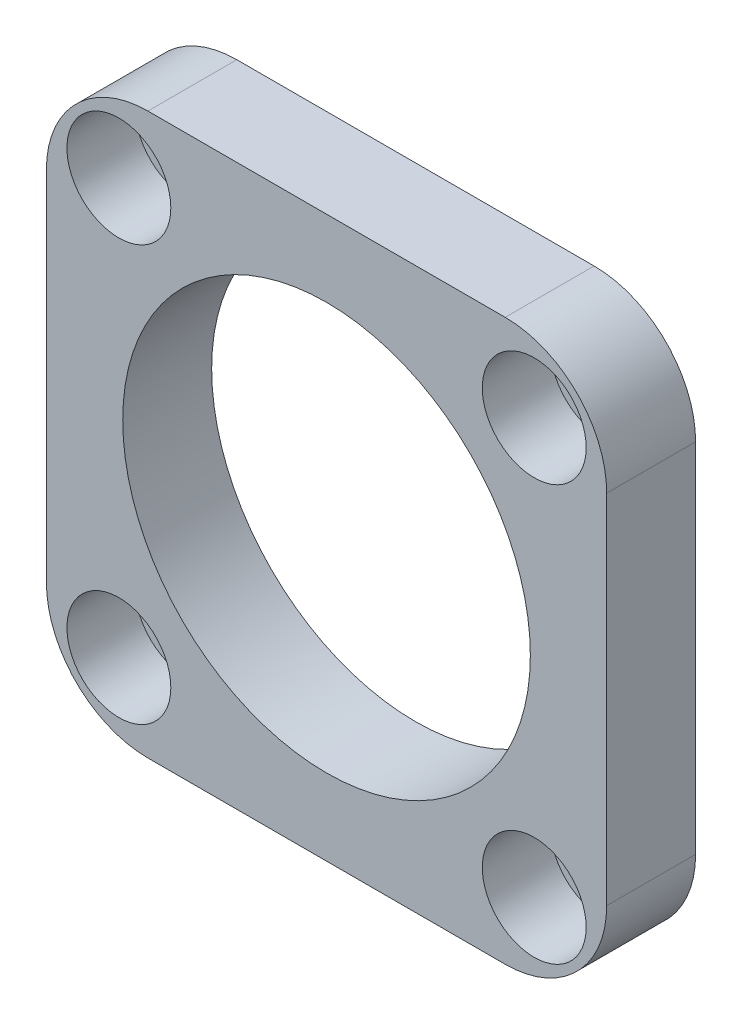
ISO-10303-21;
HEADER;
FILE_DESCRIPTION(('STEP AP214'),'2;1');
FILE_NAME('part.step','',(''),(''),'','','');
FILE_SCHEMA(('AUTOMOTIVE_DESIGN { 1 0 10303 214 1 1 1 1 }'));
ENDSEC;
DATA;
#1=APPLICATION_CONTEXT('core data for automotive mechanical design processes');
#2=APPLICATION_PROTOCOL_DEFINITION('international standard','automotive_design',2000,#1);
#3=PRODUCT_CONTEXT('',#1,'mechanical');
#4=PRODUCT('Part','Part','',(#3));
#5=PRODUCT_RELATED_PRODUCT_CATEGORY('part','',(#4));
#6=PRODUCT_DEFINITION_FORMATION('','',#4);
#7=PRODUCT_DEFINITION_CONTEXT('part definition',#1,'design');
#8=PRODUCT_DEFINITION('design','',#6,#7);
#9=PRODUCT_DEFINITION_SHAPE('','',#8);
#10=(LENGTH_UNIT() NAMED_UNIT(*) SI_UNIT(.MILLI.,.METRE.));
#11=(NAMED_UNIT(*) PLANE_ANGLE_UNIT() SI_UNIT($,.RADIAN.));
#12=(NAMED_UNIT(*) SI_UNIT($,.STERADIAN.) SOLID_ANGLE_UNIT());
#13=UNCERTAINTY_MEASURE_WITH_UNIT(LENGTH_MEASURE(1.E-05),#10,'distance_accuracy_value','');
#14=(GEOMETRIC_REPRESENTATION_CONTEXT(3) GLOBAL_UNCERTAINTY_ASSIGNED_CONTEXT((#13)) GLOBAL_UNIT_ASSIGNED_CONTEXT((#10,
#11,#12)) REPRESENTATION_CONTEXT('',''));
#15=CARTESIAN_POINT('',(0.,0.,0.));
#16=DIRECTION('',(0.,0.,1.));
#17=DIRECTION('',(1.,0.,0.));
#18=AXIS2_PLACEMENT_3D('',#15,#16,#17);
#19=CARTESIAN_POINT('',(-17.526,17.526,5.5626));
#20=DIRECTION('',(1.,0.,0.));
#21=DIRECTION('',(0.,1.,0.));
#22=AXIS2_PLACEMENT_3D('',#19,#20,#21);
#23=PLANE('',#22);
#24=DIRECTION('',(0.,-1.,0.));
#25=VECTOR('',#24,1.);
#26=CARTESIAN_POINT('',(-17.526,17.526,0.));
#27=LINE('',#26,#25);
#28=CARTESIAN_POINT('',(-17.526,11.176,0.));
#29=VERTEX_POINT('',#28);
#30=CARTESIAN_POINT('',(-17.526,-11.176,0.));
#31=VERTEX_POINT('',#30);
#32=EDGE_CURVE('E136',#29,#31,#27,.T.);
#33=ORIENTED_EDGE('',*,*,#32,.T.);
#34=DIRECTION('',(0.,0.,-1.));
#35=VECTOR('',#34,1.);
#36=CARTESIAN_POINT('',(-17.526,-11.176,5.5626));
#37=LINE('',#36,#35);
#38=CARTESIAN_POINT('',(-17.526,-11.176,5.5626));
#39=VERTEX_POINT('',#38);
#40=EDGE_CURVE('E159',#31,#39,#37,.F.);
#41=ORIENTED_EDGE('',*,*,#40,.T.);
#42=DIRECTION('',(0.,-1.,0.));
#43=VECTOR('',#42,1.);
#44=CARTESIAN_POINT('',(-17.526,17.526,5.5626));
#45=LINE('',#44,#43);
#46=CARTESIAN_POINT('',(-17.526,11.176,5.5626));
#47=VERTEX_POINT('',#46);
#48=EDGE_CURVE('E134',#47,#39,#45,.T.);
#49=ORIENTED_EDGE('',*,*,#48,.F.);
#50=DIRECTION('',(0.,0.,-1.));
#51=VECTOR('',#50,1.);
#52=CARTESIAN_POINT('',(-17.526,11.176,5.5626));
#53=LINE('',#52,#51);
#54=EDGE_CURVE('E156',#47,#29,#53,.T.);
#55=ORIENTED_EDGE('',*,*,#54,.T.);
#56=EDGE_LOOP('',(#33,#41,#49,#55));
#57=FACE_BOUND('',#56,.T.);
#58=ADVANCED_FACE('F39',(#57),#23,.F.);
#59=CARTESIAN_POINT('',(-17.526,-17.526,5.5626));
#60=DIRECTION('',(0.,1.,0.));
#61=DIRECTION('',(-1.,0.,0.));
#62=AXIS2_PLACEMENT_3D('',#59,#60,#61);
#63=PLANE('',#62);
#64=DIRECTION('',(0.,0.,-1.));
#65=VECTOR('',#64,1.);
#66=CARTESIAN_POINT('',(11.176,-17.526,5.5626));
#67=LINE('',#66,#65);
#68=CARTESIAN_POINT('',(11.176,-17.526,0.));
#69=VERTEX_POINT('',#68);
#70=CARTESIAN_POINT('',(11.176,-17.526,5.5626));
#71=VERTEX_POINT('',#70);
#72=EDGE_CURVE('E110',#69,#71,#67,.F.);
#73=ORIENTED_EDGE('',*,*,#72,.T.);
#74=DIRECTION('',(1.,0.,0.));
#75=VECTOR('',#74,1.);
#76=CARTESIAN_POINT('',(-17.526,-17.526,5.5626));
#77=LINE('',#76,#75);
#78=CARTESIAN_POINT('',(-11.176,-17.526,5.5626));
#79=VERTEX_POINT('',#78);
#80=EDGE_CURVE('E175',#79,#71,#77,.T.);
#81=ORIENTED_EDGE('',*,*,#80,.F.);
#82=DIRECTION('',(0.,0.,-1.));
#83=VECTOR('',#82,1.);
#84=CARTESIAN_POINT('',(-11.176,-17.526,5.5626));
#85=LINE('',#84,#83);
#86=CARTESIAN_POINT('',(-11.176,-17.526,0.));
#87=VERTEX_POINT('',#86);
#88=EDGE_CURVE('E115',#79,#87,#85,.T.);
#89=ORIENTED_EDGE('',*,*,#88,.T.);
#90=DIRECTION('',(1.,0.,0.));
#91=VECTOR('',#90,1.);
#92=CARTESIAN_POINT('',(-17.526,-17.526,0.));
#93=LINE('',#92,#91);
#94=EDGE_CURVE('E132',#87,#69,#93,.T.);
#95=ORIENTED_EDGE('',*,*,#94,.T.);
#96=EDGE_LOOP('',(#73,#81,#89,#95));
#97=FACE_BOUND('',#96,.T.);
#98=ADVANCED_FACE('F267',(#97),#63,.F.);
#99=CARTESIAN_POINT('',(17.526,17.526,5.5626));
#100=DIRECTION('',(-1.,0.,0.));
#101=DIRECTION('',(0.,0.,1.));
#102=AXIS2_PLACEMENT_3D('',#99,#100,#101);
#103=PLANE('',#102);
#104=DIRECTION('',(0.,1.,0.));
#105=VECTOR('',#104,1.);
#106=CARTESIAN_POINT('',(17.526,17.526,5.5626));
#107=LINE('',#106,#105);
#108=CARTESIAN_POINT('',(17.526,-11.176,5.5626));
#109=VERTEX_POINT('',#108);
#110=CARTESIAN_POINT('',(17.526,11.176,5.5626));
#111=VERTEX_POINT('',#110);
#112=EDGE_CURVE('E124',#109,#111,#107,.T.);
#113=ORIENTED_EDGE('',*,*,#112,.F.);
#114=DIRECTION('',(0.,0.,-1.));
#115=VECTOR('',#114,1.);
#116=CARTESIAN_POINT('',(17.526,-11.176,5.5626));
#117=LINE('',#116,#115);
#118=CARTESIAN_POINT('',(17.526,-11.176,0.));
#119=VERTEX_POINT('',#118);
#120=EDGE_CURVE('E108',#109,#119,#117,.T.);
#121=ORIENTED_EDGE('',*,*,#120,.T.);
#122=DIRECTION('',(0.,1.,0.));
#123=VECTOR('',#122,1.);
#124=CARTESIAN_POINT('',(17.526,17.526,0.));
#125=LINE('',#124,#123);
#126=CARTESIAN_POINT('',(17.526,11.176,0.));
#127=VERTEX_POINT('',#126);
#128=EDGE_CURVE('E122',#119,#127,#125,.T.);
#129=ORIENTED_EDGE('',*,*,#128,.T.);
#130=DIRECTION('',(0.,0.,-1.));
#131=VECTOR('',#130,1.);
#132=CARTESIAN_POINT('',(17.526,11.176,5.5626));
#133=LINE('',#132,#131);
#134=EDGE_CURVE('E126',#127,#111,#133,.F.);
#135=ORIENTED_EDGE('',*,*,#134,.T.);
#136=EDGE_LOOP('',(#113,#121,#129,#135));
#137=FACE_BOUND('',#136,.T.);
#138=ADVANCED_FACE('F121',(#137),#103,.F.);
#139=CARTESIAN_POINT('',(-17.526,17.526,5.5626));
#140=DIRECTION('',(0.,-1.,0.));
#141=DIRECTION('',(1.,0.,0.));
#142=AXIS2_PLACEMENT_3D('',#139,#140,#141);
#143=PLANE('',#142);
#144=DIRECTION('',(-1.,0.,0.));
#145=VECTOR('',#144,1.);
#146=CARTESIAN_POINT('',(-17.526,17.526,0.));
#147=LINE('',#146,#145);
#148=CARTESIAN_POINT('',(11.176,17.526,0.));
#149=VERTEX_POINT('',#148);
#150=CARTESIAN_POINT('',(-11.176,17.526,0.));
#151=VERTEX_POINT('',#150);
#152=EDGE_CURVE('E131',#149,#151,#147,.T.);
#153=ORIENTED_EDGE('',*,*,#152,.T.);
#154=DIRECTION('',(0.,0.,-1.));
#155=VECTOR('',#154,1.);
#156=CARTESIAN_POINT('',(-11.176,17.526,5.5626));
#157=LINE('',#156,#155);
#158=CARTESIAN_POINT('',(-11.176,17.526,5.5626));
#159=VERTEX_POINT('',#158);
#160=EDGE_CURVE('E11',#151,#159,#157,.F.);
#161=ORIENTED_EDGE('',*,*,#160,.T.);
#162=DIRECTION('',(-1.,0.,0.));
#163=VECTOR('',#162,1.);
#164=CARTESIAN_POINT('',(-17.526,17.526,5.5626));
#165=LINE('',#164,#163);
#166=CARTESIAN_POINT('',(11.176,17.526,5.5626));
#167=VERTEX_POINT('',#166);
#168=EDGE_CURVE('E140',#167,#159,#165,.T.);
#169=ORIENTED_EDGE('',*,*,#168,.F.);
#170=DIRECTION('',(0.,0.,-1.));
#171=VECTOR('',#170,1.);
#172=CARTESIAN_POINT('',(11.176,17.526,5.5626));
#173=LINE('',#172,#171);
#174=EDGE_CURVE('E47',#167,#149,#173,.T.);
#175=ORIENTED_EDGE('',*,*,#174,.T.);
#176=EDGE_LOOP('',(#153,#161,#169,#175));
#177=FACE_BOUND('',#176,.T.);
#178=ADVANCED_FACE('F162',(#177),#143,.F.);
#179=CARTESIAN_POINT('',(-17.526,-17.526,0.));
#180=DIRECTION('',(0.,0.,1.));
#181=DIRECTION('',(1.,0.,0.));
#182=AXIS2_PLACEMENT_3D('',#179,#180,#181);
#183=PLANE('',#182);
#184=CARTESIAN_POINT('',(-12.9921,12.9921,0.));
#185=DIRECTION('',(0.,0.,1.));
#186=DIRECTION('',(1.,0.,0.));
#187=AXIS2_PLACEMENT_3D('',#184,#185,#186);
#188=CIRCLE('',#187,2.);
#189=CARTESIAN_POINT('',(-10.9921,12.9921,0.));
#190=VERTEX_POINT('',#189);
#191=EDGE_CURVE('E242',#190,#190,#188,.T.);
#192=ORIENTED_EDGE('',*,*,#191,.T.);
#193=EDGE_LOOP('',(#192));
#194=FACE_BOUND('',#193,.T.);
#195=CARTESIAN_POINT('',(12.9921,12.9921,0.));
#196=DIRECTION('',(0.,0.,1.));
#197=DIRECTION('',(1.,0.,0.));
#198=AXIS2_PLACEMENT_3D('',#195,#196,#197);
#199=CIRCLE('',#198,2.);
#200=CARTESIAN_POINT('',(14.9921,12.9921,0.));
#201=VERTEX_POINT('',#200);
#202=EDGE_CURVE('E227',#201,#201,#199,.T.);
#203=ORIENTED_EDGE('',*,*,#202,.T.);
#204=EDGE_LOOP('',(#203));
#205=FACE_BOUND('',#204,.T.);
#206=CARTESIAN_POINT('',(12.9921,-12.9921,0.));
#207=DIRECTION('',(0.,0.,1.));
#208=DIRECTION('',(1.,0.,0.));
#209=AXIS2_PLACEMENT_3D('',#206,#207,#208);
#210=CIRCLE('',#209,2.);
#211=CARTESIAN_POINT('',(14.9921,-12.9921,0.));
#212=VERTEX_POINT('',#211);
#213=EDGE_CURVE('E212',#212,#212,#210,.T.);
#214=ORIENTED_EDGE('',*,*,#213,.T.);
#215=EDGE_LOOP('',(#214));
#216=FACE_BOUND('',#215,.T.);
#217=CARTESIAN_POINT('',(-12.9921,-12.9921,0.));
#218=DIRECTION('',(0.,0.,1.));
#219=DIRECTION('',(1.,0.,0.));
#220=AXIS2_PLACEMENT_3D('',#217,#218,#219);
#221=CIRCLE('',#220,2.);
#222=CARTESIAN_POINT('',(-10.9921,-12.9921,0.));
#223=VERTEX_POINT('',#222);
#224=EDGE_CURVE('E197',#223,#223,#221,.T.);
#225=ORIENTED_EDGE('',*,*,#224,.T.);
#226=EDGE_LOOP('',(#225));
#227=FACE_BOUND('',#226,.T.);
#228=ORIENTED_EDGE('',*,*,#128,.F.);
#229=CARTESIAN_POINT('',(11.176,-11.176,0.));
#230=DIRECTION('',(0.,0.,1.));
#231=DIRECTION('',(1.,0.,0.));
#232=AXIS2_PLACEMENT_3D('',#229,#230,#231);
#233=CIRCLE('',#232,6.35);
#234=EDGE_CURVE('E104',#119,#69,#233,.F.);
#235=ORIENTED_EDGE('',*,*,#234,.T.);
#236=ORIENTED_EDGE('',*,*,#94,.F.);
#237=CARTESIAN_POINT('',(-11.176,-11.176,0.));
#238=DIRECTION('',(0.,0.,1.));
#239=DIRECTION('',(1.,0.,0.));
#240=AXIS2_PLACEMENT_3D('',#237,#238,#239);
#241=CIRCLE('',#240,6.35);
#242=EDGE_CURVE('E116',#87,#31,#241,.F.);
#243=ORIENTED_EDGE('',*,*,#242,.T.);
#244=ORIENTED_EDGE('',*,*,#32,.F.);
#245=CARTESIAN_POINT('',(-11.176,11.176,0.));
#246=DIRECTION('',(0.,0.,1.));
#247=DIRECTION('',(1.,0.,0.));
#248=AXIS2_PLACEMENT_3D('',#245,#246,#247);
#249=CIRCLE('',#248,6.35);
#250=EDGE_CURVE('E143',#29,#151,#249,.F.);
#251=ORIENTED_EDGE('',*,*,#250,.T.);
#252=ORIENTED_EDGE('',*,*,#152,.F.);
#253=CARTESIAN_POINT('',(11.176,11.176,0.));
#254=DIRECTION('',(0.,0.,1.));
#255=DIRECTION('',(1.,0.,0.));
#256=AXIS2_PLACEMENT_3D('',#253,#254,#255);
#257=CIRCLE('',#256,6.35);
#258=EDGE_CURVE('E125',#149,#127,#257,.F.);
#259=ORIENTED_EDGE('',*,*,#258,.T.);
#260=EDGE_LOOP('',(#228,#235,#236,#243,#244,#251,#252,#259));
#261=FACE_BOUND('',#260,.T.);
#262=CARTESIAN_POINT('',(0.,0.,0.));
#263=DIRECTION('',(0.,0.,1.));
#264=DIRECTION('',(1.,0.,0.));
#265=AXIS2_PLACEMENT_3D('',#262,#263,#264);
#266=CIRCLE('',#265,12.75);
#267=CARTESIAN_POINT('',(12.75,0.,0.));
#268=VERTEX_POINT('',#267);
#269=EDGE_CURVE('E245',#268,#268,#266,.F.);
#270=ORIENTED_EDGE('',*,*,#269,.F.);
#271=EDGE_LOOP('',(#270));
#272=FACE_BOUND('',#271,.T.);
#273=ADVANCED_FACE('F128',(#194,#205,#216,#227,#261,#272),#183,.F.);
#274=CARTESIAN_POINT('',(-12.9921,-12.9921,0.3));
#275=DIRECTION('',(0.,0.,-1.));
#276=DIRECTION('',(-1.,0.,0.));
#277=AXIS2_PLACEMENT_3D('',#274,#275,#276);
#278=CONICAL_SURFACE('',#277,1.7,0.785398163397451);
#279=ORIENTED_EDGE('',*,*,#224,.F.);
#280=EDGE_LOOP('',(#279));
#281=FACE_BOUND('',#280,.T.);
#282=CARTESIAN_POINT('',(-12.9921,-12.9921,0.3));
#283=DIRECTION('',(0.,0.,1.));
#284=DIRECTION('',(1.,0.,0.));
#285=AXIS2_PLACEMENT_3D('',#282,#283,#284);
#286=CIRCLE('',#285,1.7);
#287=CARTESIAN_POINT('',(-11.2921,-12.9921,0.3));
#288=VERTEX_POINT('',#287);
#289=EDGE_CURVE('E179',#288,#288,#286,.T.);
#290=ORIENTED_EDGE('',*,*,#289,.T.);
#291=EDGE_LOOP('',(#290));
#292=FACE_BOUND('',#291,.T.);
#293=ADVANCED_FACE('F310',(#281,#292),#278,.F.);
#294=CARTESIAN_POINT('',(-12.9921,-12.9921,5.5626));
#295=DIRECTION('',(0.,0.,1.));
#296=DIRECTION('',(1.,0.,0.));
#297=AXIS2_PLACEMENT_3D('',#294,#295,#296);
#298=CYLINDRICAL_SURFACE('',#297,1.7);
#299=ORIENTED_EDGE('',*,*,#289,.F.);
#300=EDGE_LOOP('',(#299));
#301=FACE_BOUND('',#300,.T.);
#302=CARTESIAN_POINT('',(-12.9921,-12.9921,1.2926));
#303=DIRECTION('',(0.,0.,1.));
#304=DIRECTION('',(1.,0.,0.));
#305=AXIS2_PLACEMENT_3D('',#302,#303,#304);
#306=CIRCLE('',#305,1.7);
#307=CARTESIAN_POINT('',(-11.2921,-12.9921,1.2926));
#308=VERTEX_POINT('',#307);
#309=EDGE_CURVE('E184',#308,#308,#306,.T.);
#310=ORIENTED_EDGE('',*,*,#309,.T.);
#311=EDGE_LOOP('',(#310));
#312=FACE_BOUND('',#311,.T.);
#313=ADVANCED_FACE('F498',(#301,#312),#298,.F.);
#314=CARTESIAN_POINT('',(-11.2921,-12.9921,1.2926));
#315=DIRECTION('',(0.,0.,-1.));
#316=DIRECTION('',(-1.,0.,0.));
#317=AXIS2_PLACEMENT_3D('',#314,#315,#316);
#318=PLANE('',#317);
#319=ORIENTED_EDGE('',*,*,#309,.F.);
#320=EDGE_LOOP('',(#319));
#321=FACE_BOUND('',#320,.T.);
#322=CARTESIAN_POINT('',(-12.9921,-12.9921,1.2926));
#323=DIRECTION('',(0.,0.,1.));
#324=DIRECTION('',(1.,0.,0.));
#325=AXIS2_PLACEMENT_3D('',#322,#323,#324);
#326=CIRCLE('',#325,3.25);
#327=CARTESIAN_POINT('',(-9.74209999999999,-12.9921,1.2926));
#328=VERTEX_POINT('',#327);
#329=EDGE_CURVE('E188',#328,#328,#326,.T.);
#330=ORIENTED_EDGE('',*,*,#329,.T.);
#331=EDGE_LOOP('',(#330));
#332=FACE_BOUND('',#331,.T.);
#333=ADVANCED_FACE('F488',(#321,#332),#318,.F.);
#334=CARTESIAN_POINT('',(-12.9921,-12.9921,5.5626));
#335=DIRECTION('',(0.,0.,1.));
#336=DIRECTION('',(1.,0.,0.));
#337=AXIS2_PLACEMENT_3D('',#334,#335,#336);
#338=CYLINDRICAL_SURFACE('',#337,3.25);
#339=ORIENTED_EDGE('',*,*,#329,.F.);
#340=EDGE_LOOP('',(#339));
#341=FACE_BOUND('',#340,.T.);
#342=CARTESIAN_POINT('',(-12.9921,-12.9921,5.5626));
#343=DIRECTION('',(0.,0.,1.));
#344=DIRECTION('',(1.,0.,0.));
#345=AXIS2_PLACEMENT_3D('',#342,#343,#344);
#346=CIRCLE('',#345,3.25);
#347=CARTESIAN_POINT('',(-9.74209999999999,-12.9921,5.5626));
#348=VERTEX_POINT('',#347);
#349=EDGE_CURVE('E192',#348,#348,#346,.T.);
#350=ORIENTED_EDGE('',*,*,#349,.T.);
#351=EDGE_LOOP('',(#350));
#352=FACE_BOUND('',#351,.T.);
#353=ADVANCED_FACE('F478',(#341,#352),#338,.F.);
#354=CARTESIAN_POINT('',(12.9921,-12.9921,0.3));
#355=DIRECTION('',(0.,0.,-1.));
#356=DIRECTION('',(-1.,0.,0.));
#357=AXIS2_PLACEMENT_3D('',#354,#355,#356);
#358=CONICAL_SURFACE('',#357,1.7,0.785398163397451);
#359=ORIENTED_EDGE('',*,*,#213,.F.);
#360=EDGE_LOOP('',(#359));
#361=FACE_BOUND('',#360,.T.);
#362=CARTESIAN_POINT('',(12.9921,-12.9921,0.3));
#363=DIRECTION('',(0.,0.,1.));
#364=DIRECTION('',(1.,0.,0.));
#365=AXIS2_PLACEMENT_3D('',#362,#363,#364);
#366=CIRCLE('',#365,1.7);
#367=CARTESIAN_POINT('',(14.6921,-12.9921,0.3));
#368=VERTEX_POINT('',#367);
#369=EDGE_CURVE('E200',#368,#368,#366,.T.);
#370=ORIENTED_EDGE('',*,*,#369,.T.);
#371=EDGE_LOOP('',(#370));
#372=FACE_BOUND('',#371,.T.);
#373=ADVANCED_FACE('F468',(#361,#372),#358,.F.);
#374=CARTESIAN_POINT('',(12.9921,-12.9921,5.5626));
#375=DIRECTION('',(0.,0.,1.));
#376=DIRECTION('',(1.,0.,0.));
#377=AXIS2_PLACEMENT_3D('',#374,#375,#376);
#378=CYLINDRICAL_SURFACE('',#377,1.7);
#379=ORIENTED_EDGE('',*,*,#369,.F.);
#380=EDGE_LOOP('',(#379));
#381=FACE_BOUND('',#380,.T.);
#382=CARTESIAN_POINT('',(12.9921,-12.9921,1.2926));
#383=DIRECTION('',(0.,0.,1.));
#384=DIRECTION('',(1.,0.,0.));
#385=AXIS2_PLACEMENT_3D('',#382,#383,#384);
#386=CIRCLE('',#385,1.7);
#387=CARTESIAN_POINT('',(14.6921,-12.9921,1.2926));
#388=VERTEX_POINT('',#387);
#389=EDGE_CURVE('E203',#388,#388,#386,.T.);
#390=ORIENTED_EDGE('',*,*,#389,.T.);
#391=EDGE_LOOP('',(#390));
#392=FACE_BOUND('',#391,.T.);
#393=ADVANCED_FACE('F458',(#381,#392),#378,.F.);
#394=CARTESIAN_POINT('',(14.6921,-12.9921,1.2926));
#395=DIRECTION('',(0.,0.,-1.));
#396=DIRECTION('',(-1.,0.,0.));
#397=AXIS2_PLACEMENT_3D('',#394,#395,#396);
#398=PLANE('',#397);
#399=ORIENTED_EDGE('',*,*,#389,.F.);
#400=EDGE_LOOP('',(#399));
#401=FACE_BOUND('',#400,.T.);
#402=CARTESIAN_POINT('',(12.9921,-12.9921,1.2926));
#403=DIRECTION('',(0.,0.,1.));
#404=DIRECTION('',(1.,0.,0.));
#405=AXIS2_PLACEMENT_3D('',#402,#403,#404);
#406=CIRCLE('',#405,3.25);
#407=CARTESIAN_POINT('',(16.2421,-12.9921,1.2926));
#408=VERTEX_POINT('',#407);
#409=EDGE_CURVE('E206',#408,#408,#406,.T.);
#410=ORIENTED_EDGE('',*,*,#409,.T.);
#411=EDGE_LOOP('',(#410));
#412=FACE_BOUND('',#411,.T.);
#413=ADVANCED_FACE('F448',(#401,#412),#398,.F.);
#414=CARTESIAN_POINT('',(12.9921,-12.9921,5.5626));
#415=DIRECTION('',(0.,0.,1.));
#416=DIRECTION('',(1.,0.,0.));
#417=AXIS2_PLACEMENT_3D('',#414,#415,#416);
#418=CYLINDRICAL_SURFACE('',#417,3.25);
#419=ORIENTED_EDGE('',*,*,#409,.F.);
#420=EDGE_LOOP('',(#419));
#421=FACE_BOUND('',#420,.T.);
#422=CARTESIAN_POINT('',(12.9921,-12.9921,5.5626));
#423=DIRECTION('',(0.,0.,1.));
#424=DIRECTION('',(1.,0.,0.));
#425=AXIS2_PLACEMENT_3D('',#422,#423,#424);
#426=CIRCLE('',#425,3.25);
#427=CARTESIAN_POINT('',(16.2421,-12.9921,5.5626));
#428=VERTEX_POINT('',#427);
#429=EDGE_CURVE('E209',#428,#428,#426,.T.);
#430=ORIENTED_EDGE('',*,*,#429,.T.);
#431=EDGE_LOOP('',(#430));
#432=FACE_BOUND('',#431,.T.);
#433=ADVANCED_FACE('F438',(#421,#432),#418,.F.);
#434=CARTESIAN_POINT('',(12.9921,12.9921,0.3));
#435=DIRECTION('',(0.,0.,-1.));
#436=DIRECTION('',(-1.,0.,0.));
#437=AXIS2_PLACEMENT_3D('',#434,#435,#436);
#438=CONICAL_SURFACE('',#437,1.7,0.785398163397451);
#439=ORIENTED_EDGE('',*,*,#202,.F.);
#440=EDGE_LOOP('',(#439));
#441=FACE_BOUND('',#440,.T.);
#442=CARTESIAN_POINT('',(12.9921,12.9921,0.3));
#443=DIRECTION('',(0.,0.,1.));
#444=DIRECTION('',(1.,0.,0.));
#445=AXIS2_PLACEMENT_3D('',#442,#443,#444);
#446=CIRCLE('',#445,1.7);
#447=CARTESIAN_POINT('',(14.6921,12.9921,0.3));
#448=VERTEX_POINT('',#447);
#449=EDGE_CURVE('E215',#448,#448,#446,.T.);
#450=ORIENTED_EDGE('',*,*,#449,.T.);
#451=EDGE_LOOP('',(#450));
#452=FACE_BOUND('',#451,.T.);
#453=ADVANCED_FACE('F428',(#441,#452),#438,.F.);
#454=CARTESIAN_POINT('',(12.9921,12.9921,5.5626));
#455=DIRECTION('',(0.,0.,1.));
#456=DIRECTION('',(1.,0.,0.));
#457=AXIS2_PLACEMENT_3D('',#454,#455,#456);
#458=CYLINDRICAL_SURFACE('',#457,1.7);
#459=ORIENTED_EDGE('',*,*,#449,.F.);
#460=EDGE_LOOP('',(#459));
#461=FACE_BOUND('',#460,.T.);
#462=CARTESIAN_POINT('',(12.9921,12.9921,1.2926));
#463=DIRECTION('',(0.,0.,1.));
#464=DIRECTION('',(1.,0.,0.));
#465=AXIS2_PLACEMENT_3D('',#462,#463,#464);
#466=CIRCLE('',#465,1.7);
#467=CARTESIAN_POINT('',(14.6921,12.9921,1.2926));
#468=VERTEX_POINT('',#467);
#469=EDGE_CURVE('E218',#468,#468,#466,.T.);
#470=ORIENTED_EDGE('',*,*,#469,.T.);
#471=EDGE_LOOP('',(#470));
#472=FACE_BOUND('',#471,.T.);
#473=ADVANCED_FACE('F418',(#461,#472),#458,.F.);
#474=CARTESIAN_POINT('',(14.6921,12.9921,1.2926));
#475=DIRECTION('',(0.,0.,-1.));
#476=DIRECTION('',(-1.,0.,0.));
#477=AXIS2_PLACEMENT_3D('',#474,#475,#476);
#478=PLANE('',#477);
#479=ORIENTED_EDGE('',*,*,#469,.F.);
#480=EDGE_LOOP('',(#479));
#481=FACE_BOUND('',#480,.T.);
#482=CARTESIAN_POINT('',(12.9921,12.9921,1.2926));
#483=DIRECTION('',(0.,0.,1.));
#484=DIRECTION('',(1.,0.,0.));
#485=AXIS2_PLACEMENT_3D('',#482,#483,#484);
#486=CIRCLE('',#485,3.25);
#487=CARTESIAN_POINT('',(16.2421,12.9921,1.2926));
#488=VERTEX_POINT('',#487);
#489=EDGE_CURVE('E221',#488,#488,#486,.T.);
#490=ORIENTED_EDGE('',*,*,#489,.T.);
#491=EDGE_LOOP('',(#490));
#492=FACE_BOUND('',#491,.T.);
#493=ADVANCED_FACE('F408',(#481,#492),#478,.F.);
#494=CARTESIAN_POINT('',(12.9921,12.9921,5.5626));
#495=DIRECTION('',(0.,0.,1.));
#496=DIRECTION('',(1.,0.,0.));
#497=AXIS2_PLACEMENT_3D('',#494,#495,#496);
#498=CYLINDRICAL_SURFACE('',#497,3.25);
#499=ORIENTED_EDGE('',*,*,#489,.F.);
#500=EDGE_LOOP('',(#499));
#501=FACE_BOUND('',#500,.T.);
#502=CARTESIAN_POINT('',(12.9921,12.9921,5.5626));
#503=DIRECTION('',(0.,0.,1.));
#504=DIRECTION('',(1.,0.,0.));
#505=AXIS2_PLACEMENT_3D('',#502,#503,#504);
#506=CIRCLE('',#505,3.25);
#507=CARTESIAN_POINT('',(16.2421,12.9921,5.5626));
#508=VERTEX_POINT('',#507);
#509=EDGE_CURVE('E224',#508,#508,#506,.T.);
#510=ORIENTED_EDGE('',*,*,#509,.T.);
#511=EDGE_LOOP('',(#510));
#512=FACE_BOUND('',#511,.T.);
#513=ADVANCED_FACE('F398',(#501,#512),#498,.F.);
#514=CARTESIAN_POINT('',(-12.9921,12.9921,0.3));
#515=DIRECTION('',(0.,0.,-1.));
#516=DIRECTION('',(-1.,0.,0.));
#517=AXIS2_PLACEMENT_3D('',#514,#515,#516);
#518=CONICAL_SURFACE('',#517,1.7,0.785398163397451);
#519=ORIENTED_EDGE('',*,*,#191,.F.);
#520=EDGE_LOOP('',(#519));
#521=FACE_BOUND('',#520,.T.);
#522=CARTESIAN_POINT('',(-12.9921,12.9921,0.3));
#523=DIRECTION('',(0.,0.,1.));
#524=DIRECTION('',(1.,0.,0.));
#525=AXIS2_PLACEMENT_3D('',#522,#523,#524);
#526=CIRCLE('',#525,1.7);
#527=CARTESIAN_POINT('',(-11.2921,12.9921,0.3));
#528=VERTEX_POINT('',#527);
#529=EDGE_CURVE('E230',#528,#528,#526,.T.);
#530=ORIENTED_EDGE('',*,*,#529,.T.);
#531=EDGE_LOOP('',(#530));
#532=FACE_BOUND('',#531,.T.);
#533=ADVANCED_FACE('F388',(#521,#532),#518,.F.);
#534=CARTESIAN_POINT('',(-12.9921,12.9921,5.5626));
#535=DIRECTION('',(0.,0.,1.));
#536=DIRECTION('',(1.,0.,0.));
#537=AXIS2_PLACEMENT_3D('',#534,#535,#536);
#538=CYLINDRICAL_SURFACE('',#537,1.7);
#539=ORIENTED_EDGE('',*,*,#529,.F.);
#540=EDGE_LOOP('',(#539));
#541=FACE_BOUND('',#540,.T.);
#542=CARTESIAN_POINT('',(-12.9921,12.9921,1.2926));
#543=DIRECTION('',(0.,0.,1.));
#544=DIRECTION('',(1.,0.,0.));
#545=AXIS2_PLACEMENT_3D('',#542,#543,#544);
#546=CIRCLE('',#545,1.7);
#547=CARTESIAN_POINT('',(-11.2921,12.9921,1.2926));
#548=VERTEX_POINT('',#547);
#549=EDGE_CURVE('E233',#548,#548,#546,.T.);
#550=ORIENTED_EDGE('',*,*,#549,.T.);
#551=EDGE_LOOP('',(#550));
#552=FACE_BOUND('',#551,.T.);
#553=ADVANCED_FACE('F378',(#541,#552),#538,.F.);
#554=CARTESIAN_POINT('',(-11.2921,12.9921,1.2926));
#555=DIRECTION('',(0.,0.,-1.));
#556=DIRECTION('',(-1.,0.,0.));
#557=AXIS2_PLACEMENT_3D('',#554,#555,#556);
#558=PLANE('',#557);
#559=ORIENTED_EDGE('',*,*,#549,.F.);
#560=EDGE_LOOP('',(#559));
#561=FACE_BOUND('',#560,.T.);
#562=CARTESIAN_POINT('',(-12.9921,12.9921,1.2926));
#563=DIRECTION('',(0.,0.,1.));
#564=DIRECTION('',(1.,0.,0.));
#565=AXIS2_PLACEMENT_3D('',#562,#563,#564);
#566=CIRCLE('',#565,3.25);
#567=CARTESIAN_POINT('',(-9.7421,12.9921,1.2926));
#568=VERTEX_POINT('',#567);
#569=EDGE_CURVE('E236',#568,#568,#566,.T.);
#570=ORIENTED_EDGE('',*,*,#569,.T.);
#571=EDGE_LOOP('',(#570));
#572=FACE_BOUND('',#571,.T.);
#573=ADVANCED_FACE('F368',(#561,#572),#558,.F.);
#574=CARTESIAN_POINT('',(-12.9921,12.9921,5.5626));
#575=DIRECTION('',(0.,0.,1.));
#576=DIRECTION('',(1.,0.,0.));
#577=AXIS2_PLACEMENT_3D('',#574,#575,#576);
#578=CYLINDRICAL_SURFACE('',#577,3.25);
#579=ORIENTED_EDGE('',*,*,#569,.F.);
#580=EDGE_LOOP('',(#579));
#581=FACE_BOUND('',#580,.T.);
#582=CARTESIAN_POINT('',(-12.9921,12.9921,5.5626));
#583=DIRECTION('',(0.,0.,1.));
#584=DIRECTION('',(1.,0.,0.));
#585=AXIS2_PLACEMENT_3D('',#582,#583,#584);
#586=CIRCLE('',#585,3.25);
#587=CARTESIAN_POINT('',(-9.7421,12.9921,5.5626));
#588=VERTEX_POINT('',#587);
#589=EDGE_CURVE('E239',#588,#588,#586,.T.);
#590=ORIENTED_EDGE('',*,*,#589,.T.);
#591=EDGE_LOOP('',(#590));
#592=FACE_BOUND('',#591,.T.);
#593=ADVANCED_FACE('F279',(#581,#592),#578,.F.);
#594=CARTESIAN_POINT('',(11.176,-11.176,5.5626));
#595=DIRECTION('',(0.,0.,-1.));
#596=DIRECTION('',(-1.,0.,0.));
#597=AXIS2_PLACEMENT_3D('',#594,#595,#596);
#598=CYLINDRICAL_SURFACE('',#597,6.35);
#599=CARTESIAN_POINT('',(11.176,-11.176,5.5626));
#600=DIRECTION('',(0.,0.,1.));
#601=DIRECTION('',(1.,0.,0.));
#602=AXIS2_PLACEMENT_3D('',#599,#600,#601);
#603=CIRCLE('',#602,6.35);
#604=EDGE_CURVE('E154',#71,#109,#603,.T.);
#605=ORIENTED_EDGE('',*,*,#604,.F.);
#606=ORIENTED_EDGE('',*,*,#72,.F.);
#607=ORIENTED_EDGE('',*,*,#234,.F.);
#608=ORIENTED_EDGE('',*,*,#120,.F.);
#609=EDGE_LOOP('',(#605,#606,#607,#608));
#610=FACE_BOUND('',#609,.T.);
#611=ADVANCED_FACE('F107',(#610),#598,.T.);
#612=CARTESIAN_POINT('',(-11.176,-11.176,5.5626));
#613=DIRECTION('',(0.,0.,-1.));
#614=DIRECTION('',(-1.,0.,0.));
#615=AXIS2_PLACEMENT_3D('',#612,#613,#614);
#616=CYLINDRICAL_SURFACE('',#615,6.35);
#617=CARTESIAN_POINT('',(-11.176,-11.176,5.5626));
#618=DIRECTION('',(0.,0.,1.));
#619=DIRECTION('',(1.,0.,0.));
#620=AXIS2_PLACEMENT_3D('',#617,#618,#619);
#621=CIRCLE('',#620,6.35);
#622=EDGE_CURVE('E152',#39,#79,#621,.T.);
#623=ORIENTED_EDGE('',*,*,#622,.F.);
#624=ORIENTED_EDGE('',*,*,#40,.F.);
#625=ORIENTED_EDGE('',*,*,#242,.F.);
#626=ORIENTED_EDGE('',*,*,#88,.F.);
#627=EDGE_LOOP('',(#623,#624,#625,#626));
#628=FACE_BOUND('',#627,.T.);
#629=ADVANCED_FACE('F278',(#628),#616,.T.);
#630=CARTESIAN_POINT('',(-11.176,11.176,5.5626));
#631=DIRECTION('',(0.,0.,-1.));
#632=DIRECTION('',(-1.,0.,0.));
#633=AXIS2_PLACEMENT_3D('',#630,#631,#632);
#634=CYLINDRICAL_SURFACE('',#633,6.35);
#635=CARTESIAN_POINT('',(-11.176,11.176,5.5626));
#636=DIRECTION('',(0.,0.,1.));
#637=DIRECTION('',(1.,0.,0.));
#638=AXIS2_PLACEMENT_3D('',#635,#636,#637);
#639=CIRCLE('',#638,6.35);
#640=EDGE_CURVE('E150',#159,#47,#639,.T.);
#641=ORIENTED_EDGE('',*,*,#640,.F.);
#642=ORIENTED_EDGE('',*,*,#160,.F.);
#643=ORIENTED_EDGE('',*,*,#250,.F.);
#644=ORIENTED_EDGE('',*,*,#54,.F.);
#645=EDGE_LOOP('',(#641,#642,#643,#644));
#646=FACE_BOUND('',#645,.T.);
#647=ADVANCED_FACE('F169',(#646),#634,.T.);
#648=CARTESIAN_POINT('',(11.176,11.176,5.5626));
#649=DIRECTION('',(0.,0.,-1.));
#650=DIRECTION('',(-1.,0.,0.));
#651=AXIS2_PLACEMENT_3D('',#648,#649,#650);
#652=CYLINDRICAL_SURFACE('',#651,6.35);
#653=CARTESIAN_POINT('',(11.176,11.176,5.5626));
#654=DIRECTION('',(0.,0.,1.));
#655=DIRECTION('',(1.,0.,0.));
#656=AXIS2_PLACEMENT_3D('',#653,#654,#655);
#657=CIRCLE('',#656,6.35);
#658=EDGE_CURVE('E59',#111,#167,#657,.T.);
#659=ORIENTED_EDGE('',*,*,#658,.F.);
#660=ORIENTED_EDGE('',*,*,#134,.F.);
#661=ORIENTED_EDGE('',*,*,#258,.F.);
#662=ORIENTED_EDGE('',*,*,#174,.F.);
#663=EDGE_LOOP('',(#659,#660,#661,#662));
#664=FACE_BOUND('',#663,.T.);
#665=ADVANCED_FACE('F41',(#664),#652,.T.);
#666=CARTESIAN_POINT('',(-17.526,-17.526,5.5626));
#667=DIRECTION('',(0.,0.,1.));
#668=DIRECTION('',(1.,0.,0.));
#669=AXIS2_PLACEMENT_3D('',#666,#667,#668);
#670=PLANE('',#669);
#671=ORIENTED_EDGE('',*,*,#80,.T.);
#672=ORIENTED_EDGE('',*,*,#604,.T.);
#673=ORIENTED_EDGE('',*,*,#112,.T.);
#674=ORIENTED_EDGE('',*,*,#658,.T.);
#675=ORIENTED_EDGE('',*,*,#168,.T.);
#676=ORIENTED_EDGE('',*,*,#640,.T.);
#677=ORIENTED_EDGE('',*,*,#48,.T.);
#678=ORIENTED_EDGE('',*,*,#622,.T.);
#679=EDGE_LOOP('',(#671,#672,#673,#674,#675,#676,#677,#678));
#680=FACE_BOUND('',#679,.T.);
#681=ORIENTED_EDGE('',*,*,#349,.F.);
#682=EDGE_LOOP('',(#681));
#683=FACE_BOUND('',#682,.T.);
#684=ORIENTED_EDGE('',*,*,#429,.F.);
#685=EDGE_LOOP('',(#684));
#686=FACE_BOUND('',#685,.T.);
#687=ORIENTED_EDGE('',*,*,#509,.F.);
#688=EDGE_LOOP('',(#687));
#689=FACE_BOUND('',#688,.T.);
#690=ORIENTED_EDGE('',*,*,#589,.F.);
#691=EDGE_LOOP('',(#690));
#692=FACE_BOUND('',#691,.T.);
#693=CARTESIAN_POINT('',(0.,0.,5.5626));
#694=DIRECTION('',(0.,0.,1.));
#695=DIRECTION('',(1.,0.,0.));
#696=AXIS2_PLACEMENT_3D('',#693,#694,#695);
#697=CIRCLE('',#696,12.75);
#698=CARTESIAN_POINT('',(12.75,0.,5.5626));
#699=VERTEX_POINT('',#698);
#700=EDGE_CURVE('E248',#699,#699,#697,.T.);
#701=ORIENTED_EDGE('',*,*,#700,.F.);
#702=EDGE_LOOP('',(#701));
#703=FACE_BOUND('',#702,.T.);
#704=ADVANCED_FACE('F254',(#680,#683,#686,#689,#692,#703),#670,.T.);
#705=CARTESIAN_POINT('',(0.,0.,-39.5195040182235));
#706=DIRECTION('',(0.,0.,1.));
#707=DIRECTION('',(1.,0.,0.));
#708=AXIS2_PLACEMENT_3D('',#705,#706,#707);
#709=CYLINDRICAL_SURFACE('',#708,12.75);
#710=ORIENTED_EDGE('',*,*,#269,.T.);
#711=EDGE_LOOP('',(#710));
#712=FACE_BOUND('',#711,.T.);
#713=ORIENTED_EDGE('',*,*,#700,.T.);
#714=EDGE_LOOP('',(#713));
#715=FACE_BOUND('',#714,.T.);
#716=ADVANCED_FACE('F252',(#712,#715),#709,.F.);
#717=CLOSED_SHELL('',(#58,#98,#138,#178,#273,#293,#313,#333,#353,#373,#393,#413,#433,#453,#473,
#493,#513,#533,#553,#573,#593,#611,#629,#647,#665,#704,#716));
#718=MANIFOLD_SOLID_BREP('B2',#717);
#719=ADVANCED_BREP_SHAPE_REPRESENTATION('',(#18,#718),#14);
#720=SHAPE_DEFINITION_REPRESENTATION(#9,#719);
ENDSEC;
END-ISO-10303-21;
